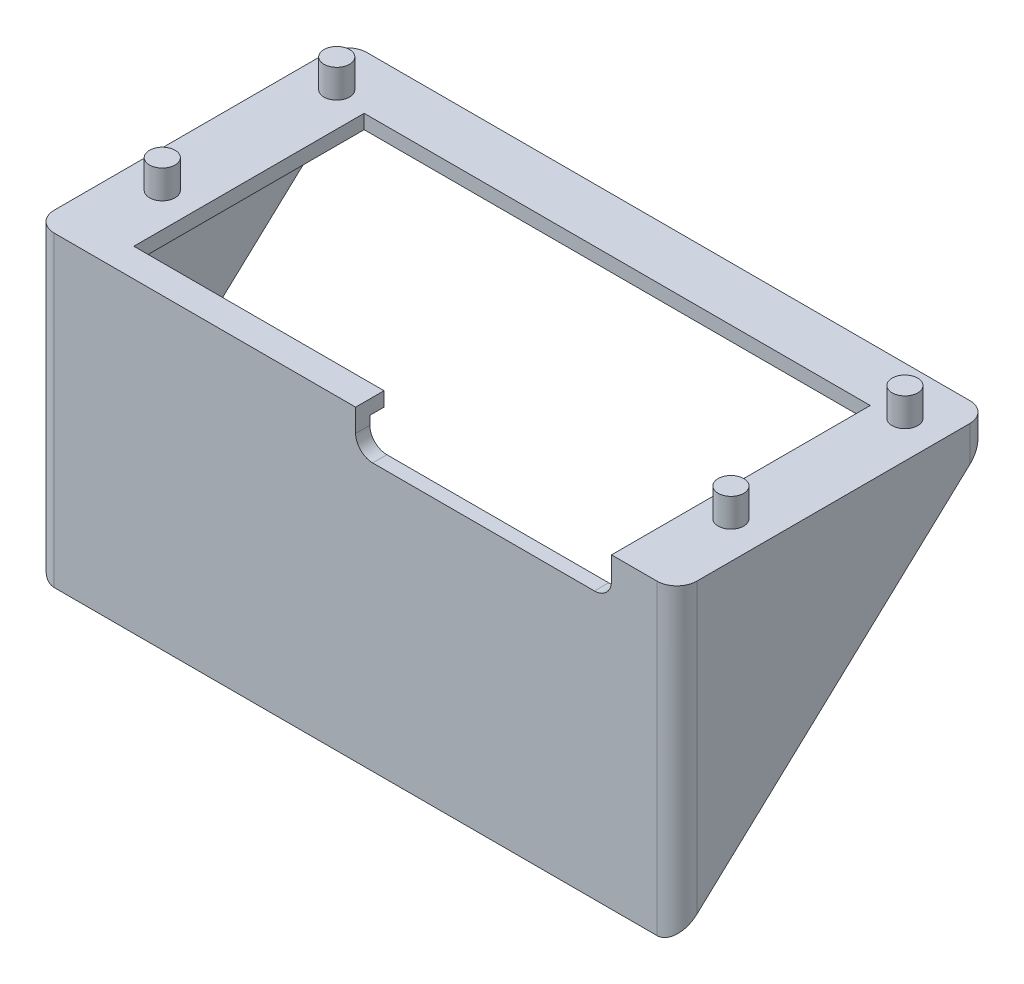
ISO-10303-21;
HEADER;
FILE_DESCRIPTION(('STEP AP214'),'2;1');
FILE_NAME('part.step','',(''),(''),'','','');
FILE_SCHEMA(('AUTOMOTIVE_DESIGN { 1 0 10303 214 1 1 1 1 }'));
ENDSEC;
DATA;
#1=APPLICATION_CONTEXT('core data for automotive mechanical design processes');
#2=APPLICATION_PROTOCOL_DEFINITION('international standard','automotive_design',2000,#1);
#3=PRODUCT_CONTEXT('',#1,'mechanical');
#4=PRODUCT('Part','Part','',(#3));
#5=PRODUCT_RELATED_PRODUCT_CATEGORY('part','',(#4));
#6=PRODUCT_DEFINITION_FORMATION('','',#4);
#7=PRODUCT_DEFINITION_CONTEXT('part definition',#1,'design');
#8=PRODUCT_DEFINITION('design','',#6,#7);
#9=PRODUCT_DEFINITION_SHAPE('','',#8);
#10=(LENGTH_UNIT() NAMED_UNIT(*) SI_UNIT(.MILLI.,.METRE.));
#11=(NAMED_UNIT(*) PLANE_ANGLE_UNIT() SI_UNIT($,.RADIAN.));
#12=(NAMED_UNIT(*) SI_UNIT($,.STERADIAN.) SOLID_ANGLE_UNIT());
#13=UNCERTAINTY_MEASURE_WITH_UNIT(LENGTH_MEASURE(1.E-05),#10,'distance_accuracy_value','');
#14=(GEOMETRIC_REPRESENTATION_CONTEXT(3) GLOBAL_UNCERTAINTY_ASSIGNED_CONTEXT((#13)) GLOBAL_UNIT_ASSIGNED_CONTEXT((#10,
#11,#12)) REPRESENTATION_CONTEXT('',''));
#15=CARTESIAN_POINT('',(0.,0.,0.));
#16=DIRECTION('',(0.,0.,1.));
#17=DIRECTION('',(1.,0.,0.));
#18=AXIS2_PLACEMENT_3D('',#15,#16,#17);
#19=CARTESIAN_POINT('',(0.,0.5,0.));
#20=DIRECTION('',(0.,1.,0.));
#21=DIRECTION('',(0.,0.,1.));
#22=AXIS2_PLACEMENT_3D('',#19,#20,#21);
#23=PLANE('',#22);
#24=DIRECTION('',(0.,0.,-1.));
#25=VECTOR('',#24,1.);
#26=CARTESIAN_POINT('',(48.9612546125461,0.5,0.));
#27=LINE('',#26,#25);
#28=CARTESIAN_POINT('',(48.9612546125461,0.5,12.470479704797));
#29=VERTEX_POINT('',#28);
#30=CARTESIAN_POINT('',(48.9612546125461,0.5,-30.5295202952029));
#31=VERTEX_POINT('',#30);
#32=EDGE_CURVE('E304',#29,#31,#27,.T.);
#33=ORIENTED_EDGE('',*,*,#32,.T.);
#34=DIRECTION('',(1.,0.,0.));
#35=VECTOR('',#34,1.);
#36=CARTESIAN_POINT('',(-40.0387453874539,0.5,-30.5295202952029));
#37=LINE('',#36,#35);
#38=CARTESIAN_POINT('',(-40.0387453874539,0.5,-30.5295202952029));
#39=VERTEX_POINT('',#38);
#40=EDGE_CURVE('E329',#39,#31,#37,.T.);
#41=ORIENTED_EDGE('',*,*,#40,.F.);
#42=DIRECTION('',(0.,0.,-1.));
#43=VECTOR('',#42,1.);
#44=CARTESIAN_POINT('',(-40.0387453874539,0.5,9.97047970479705));
#45=LINE('',#44,#43);
#46=CARTESIAN_POINT('',(-40.0387453874539,0.5,9.97047970479705));
#47=VERTEX_POINT('',#46);
#48=EDGE_CURVE('E326',#47,#39,#45,.T.);
#49=ORIENTED_EDGE('',*,*,#48,.F.);
#50=DIRECTION('',(-1.,0.,0.));
#51=VECTOR('',#50,1.);
#52=CARTESIAN_POINT('',(-40.0387453874539,0.5,9.97047970479705));
#53=LINE('',#52,#51);
#54=CARTESIAN_POINT('',(3.96125461254611,0.5,9.97047970479705));
#55=VERTEX_POINT('',#54);
#56=EDGE_CURVE('E331',#55,#47,#53,.T.);
#57=ORIENTED_EDGE('',*,*,#56,.F.);
#58=DIRECTION('',(0.,0.,1.));
#59=VECTOR('',#58,1.);
#60=CARTESIAN_POINT('',(3.96125461254611,0.5,0.));
#61=LINE('',#60,#59);
#62=CARTESIAN_POINT('',(3.96125461254611,0.5,12.470479704797));
#63=VERTEX_POINT('',#62);
#64=EDGE_CURVE('E320',#55,#63,#61,.T.);
#65=ORIENTED_EDGE('',*,*,#64,.T.);
#66=DIRECTION('',(1.,0.,0.));
#67=VECTOR('',#66,1.);
#68=CARTESIAN_POINT('',(-52.5387453874539,0.5,12.470479704797));
#69=LINE('',#68,#67);
#70=CARTESIAN_POINT('',(-50.0387453874539,0.5,12.470479704797));
#71=VERTEX_POINT('',#70);
#72=EDGE_CURVE('E355',#71,#63,#69,.T.);
#73=ORIENTED_EDGE('',*,*,#72,.F.);
#74=DIRECTION('',(0.,0.,1.));
#75=VECTOR('',#74,1.);
#76=CARTESIAN_POINT('',(-50.0387453874539,0.5,-40.0295202952029));
#77=LINE('',#76,#75);
#78=CARTESIAN_POINT('',(-50.0387453874539,0.5,-37.5295202952029));
#79=VERTEX_POINT('',#78);
#80=EDGE_CURVE('E348',#79,#71,#77,.T.);
#81=ORIENTED_EDGE('',*,*,#80,.F.);
#82=DIRECTION('',(-1.,0.,0.));
#83=VECTOR('',#82,1.);
#84=CARTESIAN_POINT('',(-52.5387453874539,0.5,-37.5295202952029));
#85=LINE('',#84,#83);
#86=CARTESIAN_POINT('',(57.9612546125461,0.5,-37.5295202952029));
#87=VERTEX_POINT('',#86);
#88=EDGE_CURVE('E343',#87,#79,#85,.T.);
#89=ORIENTED_EDGE('',*,*,#88,.F.);
#90=DIRECTION('',(0.,0.,-1.));
#91=VECTOR('',#90,1.);
#92=CARTESIAN_POINT('',(57.9612546125461,0.5,-40.0295202952029));
#93=LINE('',#92,#91);
#94=CARTESIAN_POINT('',(57.9612546125461,0.5,12.470479704797));
#95=VERTEX_POINT('',#94);
#96=EDGE_CURVE('E358',#95,#87,#93,.T.);
#97=ORIENTED_EDGE('',*,*,#96,.F.);
#98=EDGE_CURVE('E351',#29,#95,#69,.T.);
#99=ORIENTED_EDGE('',*,*,#98,.F.);
#100=EDGE_LOOP('',(#33,#41,#49,#57,#65,#73,#81,#89,#97,#99));
#101=FACE_BOUND('',#100,.T.);
#102=ADVANCED_FACE('F45',(#101),#23,.F.);
#103=CARTESIAN_POINT('',(-127.538745387454,-50.9901951359281,14.9704797047969));
#104=DIRECTION('',(0.,-0.73333333333333,-0.679869268479041));
#105=DIRECTION('',(0.,0.679869268479041,-0.733333333333331));
#106=AXIS2_PLACEMENT_3D('',#103,#104,#105);
#107=PLANE('',#106);
#108=DIRECTION('',(0.,-0.679869268479041,0.733333333333331));
#109=VECTOR('',#108,1.);
#110=CARTESIAN_POINT('',(-52.5387453874539,-50.9901951359281,14.9704797047969));
#111=LINE('',#110,#109);
#112=CARTESIAN_POINT('',(-52.5387453874539,-3.24483059955902,-36.5295202952029));
#113=VERTEX_POINT('',#112);
#114=CARTESIAN_POINT('',(-52.5387453874539,-47.7453645363691,11.4704797047971));
#115=VERTEX_POINT('',#114);
#116=EDGE_CURVE('E231',#113,#115,#111,.T.);
#117=ORIENTED_EDGE('',*,*,#116,.F.);
#118=CARTESIAN_POINT('',(-49.0387453874539,-3.24483059955902,-36.5295202952029));
#119=DIRECTION('',(0.,-0.73333333333333,-0.679869268479041));
#120=DIRECTION('',(0.,-0.679869268479041,0.733333333333331));
#121=AXIS2_PLACEMENT_3D('',#118,#119,#120);
#122=ELLIPSE('',#121,4.77272727272729,3.5);
#123=CARTESIAN_POINT('',(-49.0387453874539,0.,-40.0295202952029));
#124=VERTEX_POINT('',#123);
#125=EDGE_CURVE('E248',#113,#124,#122,.T.);
#126=ORIENTED_EDGE('',*,*,#125,.T.);
#127=DIRECTION('',(-1.,0.,0.));
#128=VECTOR('',#127,1.);
#129=CARTESIAN_POINT('',(-52.5387453874539,0.,-40.0295202952029));
#130=LINE('',#129,#128);
#131=CARTESIAN_POINT('',(56.9612546125461,0.,-40.0295202952029));
#132=VERTEX_POINT('',#131);
#133=EDGE_CURVE('E228',#132,#124,#130,.T.);
#134=ORIENTED_EDGE('',*,*,#133,.F.);
#135=CARTESIAN_POINT('',(56.9612546125461,-3.24483059955905,-36.5295202952029));
#136=DIRECTION('',(0.,-0.73333333333333,-0.679869268479041));
#137=DIRECTION('',(0.,-0.679869268479041,0.733333333333331));
#138=AXIS2_PLACEMENT_3D('',#135,#136,#137);
#139=ELLIPSE('',#138,4.77272727272729,3.5);
#140=CARTESIAN_POINT('',(60.4612546125461,-3.24483059955905,-36.5295202952029));
#141=VERTEX_POINT('',#140);
#142=EDGE_CURVE('E246',#132,#141,#139,.T.);
#143=ORIENTED_EDGE('',*,*,#142,.T.);
#144=DIRECTION('',(0.,0.679869268479041,-0.733333333333331));
#145=VECTOR('',#144,1.);
#146=CARTESIAN_POINT('',(60.4612546125461,-50.9901951359281,14.9704797047969));
#147=LINE('',#146,#145);
#148=CARTESIAN_POINT('',(60.4612546125461,-47.7453645363692,11.4704797047971));
#149=VERTEX_POINT('',#148);
#150=EDGE_CURVE('E394',#149,#141,#147,.T.);
#151=ORIENTED_EDGE('',*,*,#150,.F.);
#152=CARTESIAN_POINT('',(56.9612546125461,-47.7453645363692,11.4704797047971));
#153=DIRECTION('',(0.,-0.73333333333333,-0.679869268479041));
#154=DIRECTION('',(0.,-0.679869268479041,0.733333333333331));
#155=AXIS2_PLACEMENT_3D('',#152,#153,#154);
#156=ELLIPSE('',#155,4.77272727272729,3.5);
#157=CARTESIAN_POINT('',(56.9612546125461,-50.9901951359281,14.9704797047969));
#158=VERTEX_POINT('',#157);
#159=EDGE_CURVE('E244',#149,#158,#156,.T.);
#160=ORIENTED_EDGE('',*,*,#159,.T.);
#161=DIRECTION('',(1.,0.,0.));
#162=VECTOR('',#161,1.);
#163=CARTESIAN_POINT('',(-127.538745387454,-50.9901951359281,14.9704797047969));
#164=LINE('',#163,#162);
#165=CARTESIAN_POINT('',(-49.0387453874539,-50.9901951359281,14.9704797047969));
#166=VERTEX_POINT('',#165);
#167=EDGE_CURVE('E399',#166,#158,#164,.T.);
#168=ORIENTED_EDGE('',*,*,#167,.F.);
#169=CARTESIAN_POINT('',(-49.0387453874539,-47.7453645363691,11.4704797047971));
#170=DIRECTION('',(0.,-0.73333333333333,-0.679869268479041));
#171=DIRECTION('',(0.,-0.679869268479041,0.733333333333331));
#172=AXIS2_PLACEMENT_3D('',#169,#170,#171);
#173=ELLIPSE('',#172,4.77272727272729,3.5);
#174=EDGE_CURVE('E242',#166,#115,#173,.T.);
#175=ORIENTED_EDGE('',*,*,#174,.T.);
#176=EDGE_LOOP('',(#117,#126,#134,#143,#151,#160,#168,#175));
#177=FACE_BOUND('',#176,.T.);
#178=DIRECTION('',(-1.,0.,0.));
#179=VECTOR('',#178,1.);
#180=CARTESIAN_POINT('',(-127.538745387454,-2.31773614254212,-37.529520295203));
#181=LINE('',#180,#179);
#182=CARTESIAN_POINT('',(57.9612546125461,-2.31773614254217,-37.5295202952029));
#183=VERTEX_POINT('',#182);
#184=CARTESIAN_POINT('',(-50.0387453874539,-2.31773614254214,-37.5295202952029));
#185=VERTEX_POINT('',#184);
#186=EDGE_CURVE('E352',#183,#185,#181,.T.);
#187=ORIENTED_EDGE('',*,*,#186,.T.);
#188=DIRECTION('',(0.,-0.679869268479041,0.733333333333331));
#189=VECTOR('',#188,1.);
#190=CARTESIAN_POINT('',(-50.0387453874539,-50.9901951359281,14.9704797047969));
#191=LINE('',#190,#189);
#192=CARTESIAN_POINT('',(-50.0387453874539,-48.672458993386,12.470479704797));
#193=VERTEX_POINT('',#192);
#194=EDGE_CURVE('E363',#185,#193,#191,.T.);
#195=ORIENTED_EDGE('',*,*,#194,.T.);
#196=DIRECTION('',(1.,0.,0.));
#197=VECTOR('',#196,1.);
#198=CARTESIAN_POINT('',(-127.538745387454,-48.672458993386,12.470479704797));
#199=LINE('',#198,#197);
#200=CARTESIAN_POINT('',(57.9612546125461,-48.6724589933861,12.470479704797));
#201=VERTEX_POINT('',#200);
#202=EDGE_CURVE('E366',#193,#201,#199,.T.);
#203=ORIENTED_EDGE('',*,*,#202,.T.);
#204=DIRECTION('',(0.,0.679869268479041,-0.733333333333331));
#205=VECTOR('',#204,1.);
#206=CARTESIAN_POINT('',(57.9612546125461,-50.9901951359281,14.9704797047969));
#207=LINE('',#206,#205);
#208=EDGE_CURVE('E337',#201,#183,#207,.T.);
#209=ORIENTED_EDGE('',*,*,#208,.T.);
#210=EDGE_LOOP('',(#187,#195,#203,#209));
#211=FACE_BOUND('',#210,.T.);
#212=ADVANCED_FACE('F434',(#177,#211),#107,.T.);
#213=CARTESIAN_POINT('',(-52.5387453874539,3.,-40.0295202952029));
#214=DIRECTION('',(1.,0.,0.));
#215=DIRECTION('',(0.,0.,-1.));
#216=AXIS2_PLACEMENT_3D('',#213,#214,#215);
#217=PLANE('',#216);
#218=DIRECTION('',(0.,0.,1.));
#219=VECTOR('',#218,1.);
#220=CARTESIAN_POINT('',(-52.5387453874539,3.,-40.0295202952029));
#221=LINE('',#220,#219);
#222=CARTESIAN_POINT('',(-52.5387453874539,3.,-36.5295202952029));
#223=VERTEX_POINT('',#222);
#224=CARTESIAN_POINT('',(-52.5387453874539,3.,11.4704797047971));
#225=VERTEX_POINT('',#224);
#226=EDGE_CURVE('E221',#223,#225,#221,.T.);
#227=ORIENTED_EDGE('',*,*,#226,.F.);
#228=DIRECTION('',(0.,-1.,0.));
#229=VECTOR('',#228,1.);
#230=CARTESIAN_POINT('',(-52.5387453874539,3.,-36.5295202952029));
#231=LINE('',#230,#229);
#232=EDGE_CURVE('E239',#223,#113,#231,.T.);
#233=ORIENTED_EDGE('',*,*,#232,.T.);
#234=ORIENTED_EDGE('',*,*,#116,.T.);
#235=DIRECTION('',(0.,-1.,0.));
#236=VECTOR('',#235,1.);
#237=CARTESIAN_POINT('',(-52.5387453874539,3.,11.4704797047971));
#238=LINE('',#237,#236);
#239=EDGE_CURVE('E237',#115,#225,#238,.F.);
#240=ORIENTED_EDGE('',*,*,#239,.T.);
#241=EDGE_LOOP('',(#227,#233,#234,#240));
#242=FACE_BOUND('',#241,.T.);
#243=ADVANCED_FACE('F429',(#242),#217,.F.);
#244=CARTESIAN_POINT('',(-52.5387453874539,3.,14.970479704797));
#245=DIRECTION('',(0.,0.,-1.));
#246=DIRECTION('',(-1.,0.,0.));
#247=AXIS2_PLACEMENT_3D('',#244,#245,#246);
#248=PLANE('',#247);
#249=DIRECTION('',(1.,0.,0.));
#250=VECTOR('',#249,1.);
#251=CARTESIAN_POINT('',(-52.5387453874539,3.,14.970479704797));
#252=LINE('',#251,#250);
#253=CARTESIAN_POINT('',(48.9612546125461,3.,14.970479704797));
#254=VERTEX_POINT('',#253);
#255=CARTESIAN_POINT('',(56.9612546125461,3.,14.970479704797));
#256=VERTEX_POINT('',#255);
#257=EDGE_CURVE('E216',#254,#256,#252,.T.);
#258=ORIENTED_EDGE('',*,*,#257,.F.);
#259=DIRECTION('',(0.,1.,0.));
#260=VECTOR('',#259,1.);
#261=CARTESIAN_POINT('',(48.9612546125461,3.,14.970479704797));
#262=LINE('',#261,#260);
#263=CARTESIAN_POINT('',(48.9612546125461,-1.,14.970479704797));
#264=VERTEX_POINT('',#263);
#265=EDGE_CURVE('E307',#264,#254,#262,.T.);
#266=ORIENTED_EDGE('',*,*,#265,.F.);
#267=CARTESIAN_POINT('',(45.9612546125461,-1.,14.970479704797));
#268=DIRECTION('',(0.,0.,-1.));
#269=DIRECTION('',(-1.,0.,0.));
#270=AXIS2_PLACEMENT_3D('',#267,#268,#269);
#271=CIRCLE('',#270,3.);
#272=CARTESIAN_POINT('',(45.9612546125461,-4.,14.970479704797));
#273=VERTEX_POINT('',#272);
#274=EDGE_CURVE('E287',#264,#273,#271,.T.);
#275=ORIENTED_EDGE('',*,*,#274,.T.);
#276=DIRECTION('',(1.,0.,0.));
#277=VECTOR('',#276,1.);
#278=CARTESIAN_POINT('',(3.96125461254611,-4.,14.970479704797));
#279=LINE('',#278,#277);
#280=CARTESIAN_POINT('',(6.96125461254611,-4.,14.970479704797));
#281=VERTEX_POINT('',#280);
#282=EDGE_CURVE('E208',#281,#273,#279,.T.);
#283=ORIENTED_EDGE('',*,*,#282,.F.);
#284=CARTESIAN_POINT('',(6.96125461254611,-1.,14.970479704797));
#285=DIRECTION('',(0.,0.,-1.));
#286=DIRECTION('',(-1.,0.,0.));
#287=AXIS2_PLACEMENT_3D('',#284,#285,#286);
#288=CIRCLE('',#287,3.);
#289=CARTESIAN_POINT('',(3.96125461254611,-1.,14.970479704797));
#290=VERTEX_POINT('',#289);
#291=EDGE_CURVE('E53',#281,#290,#288,.T.);
#292=ORIENTED_EDGE('',*,*,#291,.T.);
#293=DIRECTION('',(0.,-1.,0.));
#294=VECTOR('',#293,1.);
#295=CARTESIAN_POINT('',(3.96125461254611,3.,14.970479704797));
#296=LINE('',#295,#294);
#297=CARTESIAN_POINT('',(3.96125461254611,3.,14.970479704797));
#298=VERTEX_POINT('',#297);
#299=EDGE_CURVE('E193',#298,#290,#296,.T.);
#300=ORIENTED_EDGE('',*,*,#299,.F.);
#301=CARTESIAN_POINT('',(-49.0387453874539,3.,14.970479704797));
#302=VERTEX_POINT('',#301);
#303=EDGE_CURVE('E206',#302,#298,#252,.T.);
#304=ORIENTED_EDGE('',*,*,#303,.F.);
#305=DIRECTION('',(0.,-1.,0.));
#306=VECTOR('',#305,1.);
#307=CARTESIAN_POINT('',(-49.0387453874539,3.,14.970479704797));
#308=LINE('',#307,#306);
#309=EDGE_CURVE('E267',#302,#166,#308,.T.);
#310=ORIENTED_EDGE('',*,*,#309,.T.);
#311=ORIENTED_EDGE('',*,*,#167,.T.);
#312=DIRECTION('',(0.,-1.,0.));
#313=VECTOR('',#312,1.);
#314=CARTESIAN_POINT('',(56.9612546125461,3.,14.970479704797));
#315=LINE('',#314,#313);
#316=EDGE_CURVE('E269',#158,#256,#315,.F.);
#317=ORIENTED_EDGE('',*,*,#316,.T.);
#318=EDGE_LOOP('',(#258,#266,#275,#283,#292,#300,#304,#310,#311,#317));
#319=FACE_BOUND('',#318,.T.);
#320=ADVANCED_FACE('F204',(#319),#248,.F.);
#321=CARTESIAN_POINT('',(60.4612546125461,3.,-40.0295202952029));
#322=DIRECTION('',(-1.,0.,0.));
#323=DIRECTION('',(0.,0.,1.));
#324=AXIS2_PLACEMENT_3D('',#321,#322,#323);
#325=PLANE('',#324);
#326=ORIENTED_EDGE('',*,*,#150,.T.);
#327=DIRECTION('',(0.,-1.,0.));
#328=VECTOR('',#327,1.);
#329=CARTESIAN_POINT('',(60.4612546125461,3.,-36.5295202952029));
#330=LINE('',#329,#328);
#331=CARTESIAN_POINT('',(60.4612546125461,3.,-36.5295202952029));
#332=VERTEX_POINT('',#331);
#333=EDGE_CURVE('E265',#141,#332,#330,.F.);
#334=ORIENTED_EDGE('',*,*,#333,.T.);
#335=DIRECTION('',(0.,0.,-1.));
#336=VECTOR('',#335,1.);
#337=CARTESIAN_POINT('',(60.4612546125461,3.,-40.0295202952029));
#338=LINE('',#337,#336);
#339=CARTESIAN_POINT('',(60.4612546125461,3.,11.4704797047971));
#340=VERTEX_POINT('',#339);
#341=EDGE_CURVE('E215',#340,#332,#338,.T.);
#342=ORIENTED_EDGE('',*,*,#341,.F.);
#343=DIRECTION('',(0.,-1.,0.));
#344=VECTOR('',#343,1.);
#345=CARTESIAN_POINT('',(60.4612546125461,3.,11.4704797047971));
#346=LINE('',#345,#344);
#347=EDGE_CURVE('E262',#340,#149,#346,.T.);
#348=ORIENTED_EDGE('',*,*,#347,.T.);
#349=EDGE_LOOP('',(#326,#334,#342,#348));
#350=FACE_BOUND('',#349,.T.);
#351=ADVANCED_FACE('F412',(#350),#325,.F.);
#352=CARTESIAN_POINT('',(-52.5387453874539,3.,-40.0295202952029));
#353=DIRECTION('',(0.,0.,1.));
#354=DIRECTION('',(1.,0.,0.));
#355=AXIS2_PLACEMENT_3D('',#352,#353,#354);
#356=PLANE('',#355);
#357=ORIENTED_EDGE('',*,*,#133,.T.);
#358=DIRECTION('',(0.,-1.,0.));
#359=VECTOR('',#358,1.);
#360=CARTESIAN_POINT('',(-49.0387453874539,3.,-40.0295202952029));
#361=LINE('',#360,#359);
#362=CARTESIAN_POINT('',(-49.0387453874539,3.,-40.0295202952029));
#363=VERTEX_POINT('',#362);
#364=EDGE_CURVE('E253',#124,#363,#361,.F.);
#365=ORIENTED_EDGE('',*,*,#364,.T.);
#366=DIRECTION('',(-1.,0.,0.));
#367=VECTOR('',#366,1.);
#368=CARTESIAN_POINT('',(-52.5387453874539,3.,-40.0295202952029));
#369=LINE('',#368,#367);
#370=CARTESIAN_POINT('',(56.9612546125461,3.,-40.0295202952029));
#371=VERTEX_POINT('',#370);
#372=EDGE_CURVE('E219',#371,#363,#369,.T.);
#373=ORIENTED_EDGE('',*,*,#372,.F.);
#374=DIRECTION('',(0.,-1.,0.));
#375=VECTOR('',#374,1.);
#376=CARTESIAN_POINT('',(56.9612546125461,3.,-40.0295202952029));
#377=LINE('',#376,#375);
#378=EDGE_CURVE('E250',#371,#132,#377,.T.);
#379=ORIENTED_EDGE('',*,*,#378,.T.);
#380=EDGE_LOOP('',(#357,#365,#373,#379));
#381=FACE_BOUND('',#380,.T.);
#382=ADVANCED_FACE('F421',(#381),#356,.F.);
#383=CARTESIAN_POINT('',(0.,3.,0.));
#384=DIRECTION('',(0.,1.,0.));
#385=DIRECTION('',(0.,0.,1.));
#386=AXIS2_PLACEMENT_3D('',#383,#384,#385);
#387=PLANE('',#386);
#388=DIRECTION('',(-1.,0.,0.));
#389=VECTOR('',#388,1.);
#390=CARTESIAN_POINT('',(0.,3.,-30.5295202952029));
#391=LINE('',#390,#389);
#392=CARTESIAN_POINT('',(48.9612546125461,3.,-30.5295202952029));
#393=VERTEX_POINT('',#392);
#394=CARTESIAN_POINT('',(-40.0387453874539,3.,-30.5295202952029));
#395=VERTEX_POINT('',#394);
#396=EDGE_CURVE('E227',#393,#395,#391,.T.);
#397=ORIENTED_EDGE('',*,*,#396,.F.);
#398=DIRECTION('',(0.,0.,1.));
#399=VECTOR('',#398,1.);
#400=CARTESIAN_POINT('',(48.9612546125461,3.,-76.0707104421458));
#401=LINE('',#400,#399);
#402=EDGE_CURVE('E200',#393,#254,#401,.T.);
#403=ORIENTED_EDGE('',*,*,#402,.T.);
#404=ORIENTED_EDGE('',*,*,#257,.T.);
#405=CARTESIAN_POINT('',(56.9612546125461,3.,11.4704797047971));
#406=DIRECTION('',(0.,1.,0.));
#407=DIRECTION('',(0.,0.,1.));
#408=AXIS2_PLACEMENT_3D('',#405,#406,#407);
#409=CIRCLE('',#408,3.5);
#410=EDGE_CURVE('E256',#256,#340,#409,.T.);
#411=ORIENTED_EDGE('',*,*,#410,.T.);
#412=ORIENTED_EDGE('',*,*,#341,.T.);
#413=CARTESIAN_POINT('',(56.9612546125461,3.,-36.5295202952029));
#414=DIRECTION('',(0.,1.,0.));
#415=DIRECTION('',(0.,0.,1.));
#416=AXIS2_PLACEMENT_3D('',#413,#414,#415);
#417=CIRCLE('',#416,3.5);
#418=EDGE_CURVE('E258',#332,#371,#417,.T.);
#419=ORIENTED_EDGE('',*,*,#418,.T.);
#420=ORIENTED_EDGE('',*,*,#372,.T.);
#421=CARTESIAN_POINT('',(-49.0387453874539,3.,-36.5295202952029));
#422=DIRECTION('',(0.,1.,0.));
#423=DIRECTION('',(0.,0.,1.));
#424=AXIS2_PLACEMENT_3D('',#421,#422,#423);
#425=CIRCLE('',#424,3.5);
#426=EDGE_CURVE('E260',#363,#223,#425,.T.);
#427=ORIENTED_EDGE('',*,*,#426,.T.);
#428=ORIENTED_EDGE('',*,*,#226,.T.);
#429=CARTESIAN_POINT('',(-49.0387453874539,3.,11.4704797047971));
#430=DIRECTION('',(0.,1.,0.));
#431=DIRECTION('',(0.,0.,1.));
#432=AXIS2_PLACEMENT_3D('',#429,#430,#431);
#433=CIRCLE('',#432,3.5);
#434=EDGE_CURVE('E214',#225,#302,#433,.T.);
#435=ORIENTED_EDGE('',*,*,#434,.T.);
#436=ORIENTED_EDGE('',*,*,#303,.T.);
#437=DIRECTION('',(0.,0.,1.));
#438=VECTOR('',#437,1.);
#439=CARTESIAN_POINT('',(3.96125461254611,3.,-76.0707104421458));
#440=LINE('',#439,#438);
#441=CARTESIAN_POINT('',(3.96125461254611,3.,9.97047970479704));
#442=VERTEX_POINT('',#441);
#443=EDGE_CURVE('E191',#442,#298,#440,.T.);
#444=ORIENTED_EDGE('',*,*,#443,.F.);
#445=DIRECTION('',(1.,0.,0.));
#446=VECTOR('',#445,1.);
#447=CARTESIAN_POINT('',(0.,3.,9.97047970479705));
#448=LINE('',#447,#446);
#449=CARTESIAN_POINT('',(-40.0387453874539,3.,9.97047970479705));
#450=VERTEX_POINT('',#449);
#451=EDGE_CURVE('E233',#450,#442,#448,.T.);
#452=ORIENTED_EDGE('',*,*,#451,.F.);
#453=DIRECTION('',(0.,0.,1.));
#454=VECTOR('',#453,1.);
#455=CARTESIAN_POINT('',(-40.0387453874539,3.,0.));
#456=LINE('',#455,#454);
#457=EDGE_CURVE('E235',#395,#450,#456,.T.);
#458=ORIENTED_EDGE('',*,*,#457,.F.);
#459=EDGE_LOOP('',(#397,#403,#404,#411,#412,#419,#420,#427,#428,#435,#436,#444,#452,#458));
#460=FACE_BOUND('',#459,.T.);
#461=CARTESIAN_POINT('',(-46.0387453874539,3.,-1.02952029520295));
#462=DIRECTION('',(0.,1.,0.));
#463=DIRECTION('',(0.,0.,1.));
#464=AXIS2_PLACEMENT_3D('',#461,#462,#463);
#465=CIRCLE('',#464,2.25);
#466=CARTESIAN_POINT('',(-46.0387453874539,3.,1.22047970479705));
#467=VERTEX_POINT('',#466);
#468=EDGE_CURVE('E373',#467,#467,#465,.T.);
#469=ORIENTED_EDGE('',*,*,#468,.F.);
#470=EDGE_LOOP('',(#469));
#471=FACE_BOUND('',#470,.T.);
#472=CARTESIAN_POINT('',(53.9612546125461,3.,-1.02952029520295));
#473=DIRECTION('',(0.,1.,0.));
#474=DIRECTION('',(0.,0.,1.));
#475=AXIS2_PLACEMENT_3D('',#472,#473,#474);
#476=CIRCLE('',#475,2.25);
#477=CARTESIAN_POINT('',(53.9612546125461,3.,1.22047970479705));
#478=VERTEX_POINT('',#477);
#479=EDGE_CURVE('E379',#478,#478,#476,.T.);
#480=ORIENTED_EDGE('',*,*,#479,.F.);
#481=EDGE_LOOP('',(#480));
#482=FACE_BOUND('',#481,.T.);
#483=CARTESIAN_POINT('',(53.9612546125461,3.,-31.629520295203));
#484=DIRECTION('',(0.,1.,0.));
#485=DIRECTION('',(0.,0.,1.));
#486=AXIS2_PLACEMENT_3D('',#483,#484,#485);
#487=CIRCLE('',#486,2.25);
#488=CARTESIAN_POINT('',(53.9612546125461,3.,-29.379520295203));
#489=VERTEX_POINT('',#488);
#490=EDGE_CURVE('E385',#489,#489,#487,.T.);
#491=ORIENTED_EDGE('',*,*,#490,.F.);
#492=EDGE_LOOP('',(#491));
#493=FACE_BOUND('',#492,.T.);
#494=CARTESIAN_POINT('',(-46.0387453874539,3.,-31.7095202952029));
#495=DIRECTION('',(0.,1.,0.));
#496=DIRECTION('',(0.,0.,1.));
#497=AXIS2_PLACEMENT_3D('',#494,#495,#496);
#498=CIRCLE('',#497,2.25);
#499=CARTESIAN_POINT('',(-46.0387453874539,3.,-29.4595202952029));
#500=VERTEX_POINT('',#499);
#501=EDGE_CURVE('E388',#500,#500,#498,.T.);
#502=ORIENTED_EDGE('',*,*,#501,.F.);
#503=EDGE_LOOP('',(#502));
#504=FACE_BOUND('',#503,.T.);
#505=ADVANCED_FACE('F210',(#460,#471,#482,#493,#504),#387,.T.);
#506=CARTESIAN_POINT('',(-46.0387453874539,8.,-31.7095202952029));
#507=DIRECTION('',(0.,-1.,0.));
#508=DIRECTION('',(0.,0.,-1.));
#509=AXIS2_PLACEMENT_3D('',#506,#507,#508);
#510=CYLINDRICAL_SURFACE('',#509,2.25);
#511=CARTESIAN_POINT('',(-46.0387453874539,8.,-31.7095202952029));
#512=DIRECTION('',(0.,1.,0.));
#513=DIRECTION('',(0.,0.,1.));
#514=AXIS2_PLACEMENT_3D('',#511,#512,#513);
#515=CIRCLE('',#514,2.25);
#516=CARTESIAN_POINT('',(-46.0387453874539,8.,-29.4595202952029));
#517=VERTEX_POINT('',#516);
#518=EDGE_CURVE('E391',#517,#517,#515,.T.);
#519=ORIENTED_EDGE('',*,*,#518,.F.);
#520=EDGE_LOOP('',(#519));
#521=FACE_BOUND('',#520,.T.);
#522=ORIENTED_EDGE('',*,*,#501,.T.);
#523=EDGE_LOOP('',(#522));
#524=FACE_BOUND('',#523,.T.);
#525=ADVANCED_FACE('F513',(#521,#524),#510,.T.);
#526=CARTESIAN_POINT('',(-46.0387453874539,8.,-31.7095202952029));
#527=DIRECTION('',(0.,1.,0.));
#528=DIRECTION('',(0.,0.,1.));
#529=AXIS2_PLACEMENT_3D('',#526,#527,#528);
#530=PLANE('',#529);
#531=ORIENTED_EDGE('',*,*,#518,.T.);
#532=EDGE_LOOP('',(#531));
#533=FACE_BOUND('',#532,.T.);
#534=ADVANCED_FACE('F506',(#533),#530,.T.);
#535=CARTESIAN_POINT('',(53.9612546125461,8.,-31.629520295203));
#536=DIRECTION('',(0.,-1.,0.));
#537=DIRECTION('',(0.,0.,-1.));
#538=AXIS2_PLACEMENT_3D('',#535,#536,#537);
#539=CYLINDRICAL_SURFACE('',#538,2.25);
#540=CARTESIAN_POINT('',(53.9612546125461,8.,-31.629520295203));
#541=DIRECTION('',(0.,1.,0.));
#542=DIRECTION('',(0.,0.,1.));
#543=AXIS2_PLACEMENT_3D('',#540,#541,#542);
#544=CIRCLE('',#543,2.25);
#545=CARTESIAN_POINT('',(53.9612546125461,8.,-29.379520295203));
#546=VERTEX_POINT('',#545);
#547=EDGE_CURVE('E382',#546,#546,#544,.T.);
#548=ORIENTED_EDGE('',*,*,#547,.F.);
#549=EDGE_LOOP('',(#548));
#550=FACE_BOUND('',#549,.T.);
#551=ORIENTED_EDGE('',*,*,#490,.T.);
#552=EDGE_LOOP('',(#551));
#553=FACE_BOUND('',#552,.T.);
#554=ADVANCED_FACE('F503',(#550,#553),#539,.T.);
#555=CARTESIAN_POINT('',(53.9612546125461,8.,-31.629520295203));
#556=DIRECTION('',(0.,1.,0.));
#557=DIRECTION('',(0.,0.,1.));
#558=AXIS2_PLACEMENT_3D('',#555,#556,#557);
#559=PLANE('',#558);
#560=ORIENTED_EDGE('',*,*,#547,.T.);
#561=EDGE_LOOP('',(#560));
#562=FACE_BOUND('',#561,.T.);
#563=ADVANCED_FACE('F498',(#562),#559,.T.);
#564=CARTESIAN_POINT('',(53.9612546125461,8.,-1.02952029520295));
#565=DIRECTION('',(0.,-1.,0.));
#566=DIRECTION('',(0.,0.,-1.));
#567=AXIS2_PLACEMENT_3D('',#564,#565,#566);
#568=CYLINDRICAL_SURFACE('',#567,2.25);
#569=CARTESIAN_POINT('',(53.9612546125461,8.,-1.02952029520295));
#570=DIRECTION('',(0.,1.,0.));
#571=DIRECTION('',(0.,0.,1.));
#572=AXIS2_PLACEMENT_3D('',#569,#570,#571);
#573=CIRCLE('',#572,2.25);
#574=CARTESIAN_POINT('',(53.9612546125461,8.,1.22047970479705));
#575=VERTEX_POINT('',#574);
#576=EDGE_CURVE('E376',#575,#575,#573,.T.);
#577=ORIENTED_EDGE('',*,*,#576,.F.);
#578=EDGE_LOOP('',(#577));
#579=FACE_BOUND('',#578,.T.);
#580=ORIENTED_EDGE('',*,*,#479,.T.);
#581=EDGE_LOOP('',(#580));
#582=FACE_BOUND('',#581,.T.);
#583=ADVANCED_FACE('F495',(#579,#582),#568,.T.);
#584=CARTESIAN_POINT('',(53.9612546125461,8.,-1.02952029520295));
#585=DIRECTION('',(0.,1.,0.));
#586=DIRECTION('',(0.,0.,1.));
#587=AXIS2_PLACEMENT_3D('',#584,#585,#586);
#588=PLANE('',#587);
#589=ORIENTED_EDGE('',*,*,#576,.T.);
#590=EDGE_LOOP('',(#589));
#591=FACE_BOUND('',#590,.T.);
#592=ADVANCED_FACE('F490',(#591),#588,.T.);
#593=CARTESIAN_POINT('',(-46.0387453874539,8.,-1.02952029520295));
#594=DIRECTION('',(0.,-1.,0.));
#595=DIRECTION('',(0.,0.,-1.));
#596=AXIS2_PLACEMENT_3D('',#593,#594,#595);
#597=CYLINDRICAL_SURFACE('',#596,2.25);
#598=CARTESIAN_POINT('',(-46.0387453874539,8.,-1.02952029520295));
#599=DIRECTION('',(0.,1.,0.));
#600=DIRECTION('',(0.,0.,1.));
#601=AXIS2_PLACEMENT_3D('',#598,#599,#600);
#602=CIRCLE('',#601,2.25);
#603=CARTESIAN_POINT('',(-46.0387453874539,8.,1.22047970479705));
#604=VERTEX_POINT('',#603);
#605=EDGE_CURVE('E346',#604,#604,#602,.T.);
#606=ORIENTED_EDGE('',*,*,#605,.F.);
#607=EDGE_LOOP('',(#606));
#608=FACE_BOUND('',#607,.T.);
#609=ORIENTED_EDGE('',*,*,#468,.T.);
#610=EDGE_LOOP('',(#609));
#611=FACE_BOUND('',#610,.T.);
#612=ADVANCED_FACE('F486',(#608,#611),#597,.T.);
#613=CARTESIAN_POINT('',(-46.0387453874539,8.,-1.02952029520295));
#614=DIRECTION('',(0.,1.,0.));
#615=DIRECTION('',(0.,0.,1.));
#616=AXIS2_PLACEMENT_3D('',#613,#614,#615);
#617=PLANE('',#616);
#618=ORIENTED_EDGE('',*,*,#605,.T.);
#619=EDGE_LOOP('',(#618));
#620=FACE_BOUND('',#619,.T.);
#621=ADVANCED_FACE('F489',(#620),#617,.T.);
#622=CARTESIAN_POINT('',(-50.0387453874539,3.,-40.0295202952029));
#623=DIRECTION('',(1.,0.,0.));
#624=DIRECTION('',(0.,0.,-1.));
#625=AXIS2_PLACEMENT_3D('',#622,#623,#624);
#626=PLANE('',#625);
#627=DIRECTION('',(0.,-1.,0.));
#628=VECTOR('',#627,1.);
#629=CARTESIAN_POINT('',(-50.0387453874539,3.,-37.5295202952029));
#630=LINE('',#629,#628);
#631=EDGE_CURVE('E339',#79,#185,#630,.T.);
#632=ORIENTED_EDGE('',*,*,#631,.F.);
#633=ORIENTED_EDGE('',*,*,#80,.T.);
#634=DIRECTION('',(0.,-1.,0.));
#635=VECTOR('',#634,1.);
#636=CARTESIAN_POINT('',(-50.0387453874539,3.,12.470479704797));
#637=LINE('',#636,#635);
#638=EDGE_CURVE('E344',#71,#193,#637,.T.);
#639=ORIENTED_EDGE('',*,*,#638,.T.);
#640=ORIENTED_EDGE('',*,*,#194,.F.);
#641=EDGE_LOOP('',(#632,#633,#639,#640));
#642=FACE_BOUND('',#641,.T.);
#643=ADVANCED_FACE('F450',(#642),#626,.T.);
#644=CARTESIAN_POINT('',(-52.5387453874539,3.,12.470479704797));
#645=DIRECTION('',(0.,0.,-1.));
#646=DIRECTION('',(-1.,0.,0.));
#647=AXIS2_PLACEMENT_3D('',#644,#645,#646);
#648=PLANE('',#647);
#649=DIRECTION('',(0.,-1.,0.));
#650=VECTOR('',#649,1.);
#651=CARTESIAN_POINT('',(48.9612546125461,3.,12.470479704797));
#652=LINE('',#651,#650);
#653=CARTESIAN_POINT('',(48.9612546125461,-1.,12.470479704797));
#654=VERTEX_POINT('',#653);
#655=EDGE_CURVE('E275',#29,#654,#652,.T.);
#656=ORIENTED_EDGE('',*,*,#655,.F.);
#657=ORIENTED_EDGE('',*,*,#98,.T.);
#658=DIRECTION('',(0.,-1.,0.));
#659=VECTOR('',#658,1.);
#660=CARTESIAN_POINT('',(57.9612546125461,3.,12.470479704797));
#661=LINE('',#660,#659);
#662=EDGE_CURVE('E347',#95,#201,#661,.T.);
#663=ORIENTED_EDGE('',*,*,#662,.T.);
#664=ORIENTED_EDGE('',*,*,#202,.F.);
#665=ORIENTED_EDGE('',*,*,#638,.F.);
#666=ORIENTED_EDGE('',*,*,#72,.T.);
#667=DIRECTION('',(0.,1.,0.));
#668=VECTOR('',#667,1.);
#669=CARTESIAN_POINT('',(3.96125461254611,3.00000000000001,12.470479704797));
#670=LINE('',#669,#668);
#671=CARTESIAN_POINT('',(3.96125461254611,-1.,12.470479704797));
#672=VERTEX_POINT('',#671);
#673=EDGE_CURVE('E323',#672,#63,#670,.T.);
#674=ORIENTED_EDGE('',*,*,#673,.F.);
#675=CARTESIAN_POINT('',(6.96125461254611,-1.,12.470479704797));
#676=DIRECTION('',(0.,0.,-1.));
#677=DIRECTION('',(-1.,0.,0.));
#678=AXIS2_PLACEMENT_3D('',#675,#676,#677);
#679=CIRCLE('',#678,3.);
#680=CARTESIAN_POINT('',(6.96125461254611,-4.,12.470479704797));
#681=VERTEX_POINT('',#680);
#682=EDGE_CURVE('E11',#672,#681,#679,.F.);
#683=ORIENTED_EDGE('',*,*,#682,.T.);
#684=DIRECTION('',(-1.,0.,0.));
#685=VECTOR('',#684,1.);
#686=CARTESIAN_POINT('',(-52.5387453874539,-4.,12.470479704797));
#687=LINE('',#686,#685);
#688=CARTESIAN_POINT('',(45.9612546125461,-4.,12.470479704797));
#689=VERTEX_POINT('',#688);
#690=EDGE_CURVE('E272',#689,#681,#687,.T.);
#691=ORIENTED_EDGE('',*,*,#690,.F.);
#692=CARTESIAN_POINT('',(45.9612546125461,-1.,12.470479704797));
#693=DIRECTION('',(0.,0.,-1.));
#694=DIRECTION('',(-1.,0.,0.));
#695=AXIS2_PLACEMENT_3D('',#692,#693,#694);
#696=CIRCLE('',#695,3.);
#697=EDGE_CURVE('E289',#689,#654,#696,.F.);
#698=ORIENTED_EDGE('',*,*,#697,.T.);
#699=EDGE_LOOP('',(#656,#657,#663,#664,#665,#666,#674,#683,#691,#698));
#700=FACE_BOUND('',#699,.T.);
#701=ADVANCED_FACE('F294',(#700),#648,.T.);
#702=CARTESIAN_POINT('',(57.9612546125461,3.,-40.0295202952029));
#703=DIRECTION('',(-1.,0.,0.));
#704=DIRECTION('',(0.,0.,1.));
#705=AXIS2_PLACEMENT_3D('',#702,#703,#704);
#706=PLANE('',#705);
#707=ORIENTED_EDGE('',*,*,#662,.F.);
#708=ORIENTED_EDGE('',*,*,#96,.T.);
#709=DIRECTION('',(0.,-1.,0.));
#710=VECTOR('',#709,1.);
#711=CARTESIAN_POINT('',(57.9612546125461,3.,-37.5295202952029));
#712=LINE('',#711,#710);
#713=EDGE_CURVE('E342',#87,#183,#712,.T.);
#714=ORIENTED_EDGE('',*,*,#713,.T.);
#715=ORIENTED_EDGE('',*,*,#208,.F.);
#716=EDGE_LOOP('',(#707,#708,#714,#715));
#717=FACE_BOUND('',#716,.T.);
#718=ADVANCED_FACE('F445',(#717),#706,.T.);
#719=CARTESIAN_POINT('',(-52.5387453874539,3.,-37.5295202952029));
#720=DIRECTION('',(0.,0.,1.));
#721=DIRECTION('',(1.,0.,0.));
#722=AXIS2_PLACEMENT_3D('',#719,#720,#721);
#723=PLANE('',#722);
#724=ORIENTED_EDGE('',*,*,#186,.F.);
#725=ORIENTED_EDGE('',*,*,#713,.F.);
#726=ORIENTED_EDGE('',*,*,#88,.T.);
#727=ORIENTED_EDGE('',*,*,#631,.T.);
#728=EDGE_LOOP('',(#724,#725,#726,#727));
#729=FACE_BOUND('',#728,.T.);
#730=ADVANCED_FACE('F440',(#729),#723,.T.);
#731=CARTESIAN_POINT('',(-40.0387453874539,10.5,9.97047970479705));
#732=DIRECTION('',(-1.,0.,0.));
#733=DIRECTION('',(0.,0.,1.));
#734=AXIS2_PLACEMENT_3D('',#731,#732,#733);
#735=PLANE('',#734);
#736=ORIENTED_EDGE('',*,*,#457,.T.);
#737=DIRECTION('',(0.,-1.,0.));
#738=VECTOR('',#737,1.);
#739=CARTESIAN_POINT('',(-40.0387453874539,10.5,9.97047970479705));
#740=LINE('',#739,#738);
#741=EDGE_CURVE('E334',#450,#47,#740,.T.);
#742=ORIENTED_EDGE('',*,*,#741,.T.);
#743=ORIENTED_EDGE('',*,*,#48,.T.);
#744=DIRECTION('',(0.,-1.,0.));
#745=VECTOR('',#744,1.);
#746=CARTESIAN_POINT('',(-40.0387453874539,10.5,-30.5295202952029));
#747=LINE('',#746,#745);
#748=EDGE_CURVE('E333',#395,#39,#747,.T.);
#749=ORIENTED_EDGE('',*,*,#748,.F.);
#750=EDGE_LOOP('',(#736,#742,#743,#749));
#751=FACE_BOUND('',#750,.T.);
#752=ADVANCED_FACE('F462',(#751),#735,.F.);
#753=CARTESIAN_POINT('',(-40.0387453874539,10.5,9.97047970479705));
#754=DIRECTION('',(0.,0.,1.));
#755=DIRECTION('',(1.,0.,0.));
#756=AXIS2_PLACEMENT_3D('',#753,#754,#755);
#757=PLANE('',#756);
#758=ORIENTED_EDGE('',*,*,#451,.T.);
#759=DIRECTION('',(0.,-1.,0.));
#760=VECTOR('',#759,1.);
#761=CARTESIAN_POINT('',(3.96125461254611,10.5,9.97047970479705));
#762=LINE('',#761,#760);
#763=EDGE_CURVE('E195',#442,#55,#762,.T.);
#764=ORIENTED_EDGE('',*,*,#763,.T.);
#765=ORIENTED_EDGE('',*,*,#56,.T.);
#766=ORIENTED_EDGE('',*,*,#741,.F.);
#767=EDGE_LOOP('',(#758,#764,#765,#766));
#768=FACE_BOUND('',#767,.T.);
#769=ADVANCED_FACE('F457',(#768),#757,.F.);
#770=CARTESIAN_POINT('',(-40.0387453874539,10.5,-30.5295202952029));
#771=DIRECTION('',(0.,0.,-1.));
#772=DIRECTION('',(-1.,0.,0.));
#773=AXIS2_PLACEMENT_3D('',#770,#771,#772);
#774=PLANE('',#773);
#775=ORIENTED_EDGE('',*,*,#40,.T.);
#776=DIRECTION('',(0.,1.,0.));
#777=VECTOR('',#776,1.);
#778=CARTESIAN_POINT('',(48.9612546125461,3.,-30.5295202952029));
#779=LINE('',#778,#777);
#780=EDGE_CURVE('E312',#31,#393,#779,.T.);
#781=ORIENTED_EDGE('',*,*,#780,.T.);
#782=ORIENTED_EDGE('',*,*,#396,.T.);
#783=ORIENTED_EDGE('',*,*,#748,.T.);
#784=EDGE_LOOP('',(#775,#781,#782,#783));
#785=FACE_BOUND('',#784,.T.);
#786=ADVANCED_FACE('F465',(#785),#774,.F.);
#787=CARTESIAN_POINT('',(-49.0387453874539,3.,-36.5295202952029));
#788=DIRECTION('',(0.,-1.,0.));
#789=DIRECTION('',(0.,0.,-1.));
#790=AXIS2_PLACEMENT_3D('',#787,#788,#789);
#791=CYLINDRICAL_SURFACE('',#790,3.5);
#792=ORIENTED_EDGE('',*,*,#426,.F.);
#793=ORIENTED_EDGE('',*,*,#364,.F.);
#794=ORIENTED_EDGE('',*,*,#125,.F.);
#795=ORIENTED_EDGE('',*,*,#232,.F.);
#796=EDGE_LOOP('',(#792,#793,#794,#795));
#797=FACE_BOUND('',#796,.T.);
#798=ADVANCED_FACE('F425',(#797),#791,.T.);
#799=CARTESIAN_POINT('',(56.9612546125461,3.,-36.5295202952029));
#800=DIRECTION('',(0.,-1.,0.));
#801=DIRECTION('',(0.,0.,-1.));
#802=AXIS2_PLACEMENT_3D('',#799,#800,#801);
#803=CYLINDRICAL_SURFACE('',#802,3.5);
#804=ORIENTED_EDGE('',*,*,#418,.F.);
#805=ORIENTED_EDGE('',*,*,#333,.F.);
#806=ORIENTED_EDGE('',*,*,#142,.F.);
#807=ORIENTED_EDGE('',*,*,#378,.F.);
#808=EDGE_LOOP('',(#804,#805,#806,#807));
#809=FACE_BOUND('',#808,.T.);
#810=ADVANCED_FACE('F416',(#809),#803,.T.);
#811=CARTESIAN_POINT('',(56.9612546125461,3.,11.4704797047971));
#812=DIRECTION('',(0.,-1.,0.));
#813=DIRECTION('',(0.,0.,-1.));
#814=AXIS2_PLACEMENT_3D('',#811,#812,#813);
#815=CYLINDRICAL_SURFACE('',#814,3.5);
#816=ORIENTED_EDGE('',*,*,#410,.F.);
#817=ORIENTED_EDGE('',*,*,#316,.F.);
#818=ORIENTED_EDGE('',*,*,#159,.F.);
#819=ORIENTED_EDGE('',*,*,#347,.F.);
#820=EDGE_LOOP('',(#816,#817,#818,#819));
#821=FACE_BOUND('',#820,.T.);
#822=ADVANCED_FACE('F407',(#821),#815,.T.);
#823=CARTESIAN_POINT('',(-49.0387453874539,3.,11.4704797047971));
#824=DIRECTION('',(0.,-1.,0.));
#825=DIRECTION('',(0.,0.,-1.));
#826=AXIS2_PLACEMENT_3D('',#823,#824,#825);
#827=CYLINDRICAL_SURFACE('',#826,3.5);
#828=ORIENTED_EDGE('',*,*,#434,.F.);
#829=ORIENTED_EDGE('',*,*,#239,.F.);
#830=ORIENTED_EDGE('',*,*,#174,.F.);
#831=ORIENTED_EDGE('',*,*,#309,.F.);
#832=EDGE_LOOP('',(#828,#829,#830,#831));
#833=FACE_BOUND('',#832,.T.);
#834=ADVANCED_FACE('F433',(#833),#827,.T.);
#835=CARTESIAN_POINT('',(48.9612546125461,3.,-76.0707104421458));
#836=DIRECTION('',(1.,0.,0.));
#837=DIRECTION('',(0.,0.,-1.));
#838=AXIS2_PLACEMENT_3D('',#835,#836,#837);
#839=PLANE('',#838);
#840=ORIENTED_EDGE('',*,*,#655,.T.);
#841=DIRECTION('',(0.,0.,1.));
#842=VECTOR('',#841,1.);
#843=CARTESIAN_POINT('',(48.9612546125461,-1.,14.970479704797));
#844=LINE('',#843,#842);
#845=EDGE_CURVE('E278',#654,#264,#844,.T.);
#846=ORIENTED_EDGE('',*,*,#845,.T.);
#847=ORIENTED_EDGE('',*,*,#265,.T.);
#848=ORIENTED_EDGE('',*,*,#402,.F.);
#849=ORIENTED_EDGE('',*,*,#780,.F.);
#850=ORIENTED_EDGE('',*,*,#32,.F.);
#851=EDGE_LOOP('',(#840,#846,#847,#848,#849,#850));
#852=FACE_BOUND('',#851,.T.);
#853=ADVANCED_FACE('F300',(#852),#839,.F.);
#854=CARTESIAN_POINT('',(3.96125461254611,-4.,-76.0707104421458));
#855=DIRECTION('',(0.,-1.,0.));
#856=DIRECTION('',(0.,0.,-1.));
#857=AXIS2_PLACEMENT_3D('',#854,#855,#856);
#858=PLANE('',#857);
#859=ORIENTED_EDGE('',*,*,#282,.T.);
#860=DIRECTION('',(0.,0.,1.));
#861=VECTOR('',#860,1.);
#862=CARTESIAN_POINT('',(45.9612546125461,-4.,12.470479704797));
#863=LINE('',#862,#861);
#864=EDGE_CURVE('E284',#273,#689,#863,.F.);
#865=ORIENTED_EDGE('',*,*,#864,.T.);
#866=ORIENTED_EDGE('',*,*,#690,.T.);
#867=DIRECTION('',(0.,0.,1.));
#868=VECTOR('',#867,1.);
#869=CARTESIAN_POINT('',(6.96125461254611,-4.,14.970479704797));
#870=LINE('',#869,#868);
#871=EDGE_CURVE('E281',#681,#281,#870,.T.);
#872=ORIENTED_EDGE('',*,*,#871,.T.);
#873=EDGE_LOOP('',(#859,#865,#866,#872));
#874=FACE_BOUND('',#873,.T.);
#875=ADVANCED_FACE('F309',(#874),#858,.F.);
#876=CARTESIAN_POINT('',(3.96125461254611,3.,-76.0707104421458));
#877=DIRECTION('',(-1.,0.,0.));
#878=DIRECTION('',(0.,-1.,0.));
#879=AXIS2_PLACEMENT_3D('',#876,#877,#878);
#880=PLANE('',#879);
#881=ORIENTED_EDGE('',*,*,#299,.T.);
#882=DIRECTION('',(0.,0.,1.));
#883=VECTOR('',#882,1.);
#884=CARTESIAN_POINT('',(3.96125461254611,-1.,12.470479704797));
#885=LINE('',#884,#883);
#886=EDGE_CURVE('E66',#290,#672,#885,.F.);
#887=ORIENTED_EDGE('',*,*,#886,.T.);
#888=ORIENTED_EDGE('',*,*,#673,.T.);
#889=ORIENTED_EDGE('',*,*,#64,.F.);
#890=ORIENTED_EDGE('',*,*,#763,.F.);
#891=ORIENTED_EDGE('',*,*,#443,.T.);
#892=EDGE_LOOP('',(#881,#887,#888,#889,#890,#891));
#893=FACE_BOUND('',#892,.T.);
#894=ADVANCED_FACE('F192',(#893),#880,.F.);
#895=CARTESIAN_POINT('',(45.9612546125461,-1.,-76.0707104421458));
#896=DIRECTION('',(0.,0.,-1.));
#897=DIRECTION('',(-1.,0.,0.));
#898=AXIS2_PLACEMENT_3D('',#895,#896,#897);
#899=CYLINDRICAL_SURFACE('',#898,3.);
#900=ORIENTED_EDGE('',*,*,#697,.F.);
#901=ORIENTED_EDGE('',*,*,#864,.F.);
#902=ORIENTED_EDGE('',*,*,#274,.F.);
#903=ORIENTED_EDGE('',*,*,#845,.F.);
#904=EDGE_LOOP('',(#900,#901,#902,#903));
#905=FACE_BOUND('',#904,.T.);
#906=ADVANCED_FACE('F305',(#905),#899,.F.);
#907=CARTESIAN_POINT('',(6.96125461254611,-1.,-76.0707104421458));
#908=DIRECTION('',(0.,0.,-1.));
#909=DIRECTION('',(-1.,0.,0.));
#910=AXIS2_PLACEMENT_3D('',#907,#908,#909);
#911=CYLINDRICAL_SURFACE('',#910,3.);
#912=ORIENTED_EDGE('',*,*,#682,.F.);
#913=ORIENTED_EDGE('',*,*,#886,.F.);
#914=ORIENTED_EDGE('',*,*,#291,.F.);
#915=ORIENTED_EDGE('',*,*,#871,.F.);
#916=EDGE_LOOP('',(#912,#913,#914,#915));
#917=FACE_BOUND('',#916,.T.);
#918=ADVANCED_FACE('F47',(#917),#911,.F.);
#919=CLOSED_SHELL('',(#102,#212,#243,#320,#351,#382,#505,#525,#534,#554,#563,#583,#592,#612,
#621,#643,#701,#718,#730,#752,#769,#786,#798,#810,#822,#834,#853,#875,#894,#906,#918));
#920=MANIFOLD_SOLID_BREP('B2',#919);
#921=ADVANCED_BREP_SHAPE_REPRESENTATION('',(#18,#920),#14);
#922=SHAPE_DEFINITION_REPRESENTATION(#9,#921);
ENDSEC;
END-ISO-10303-21;
